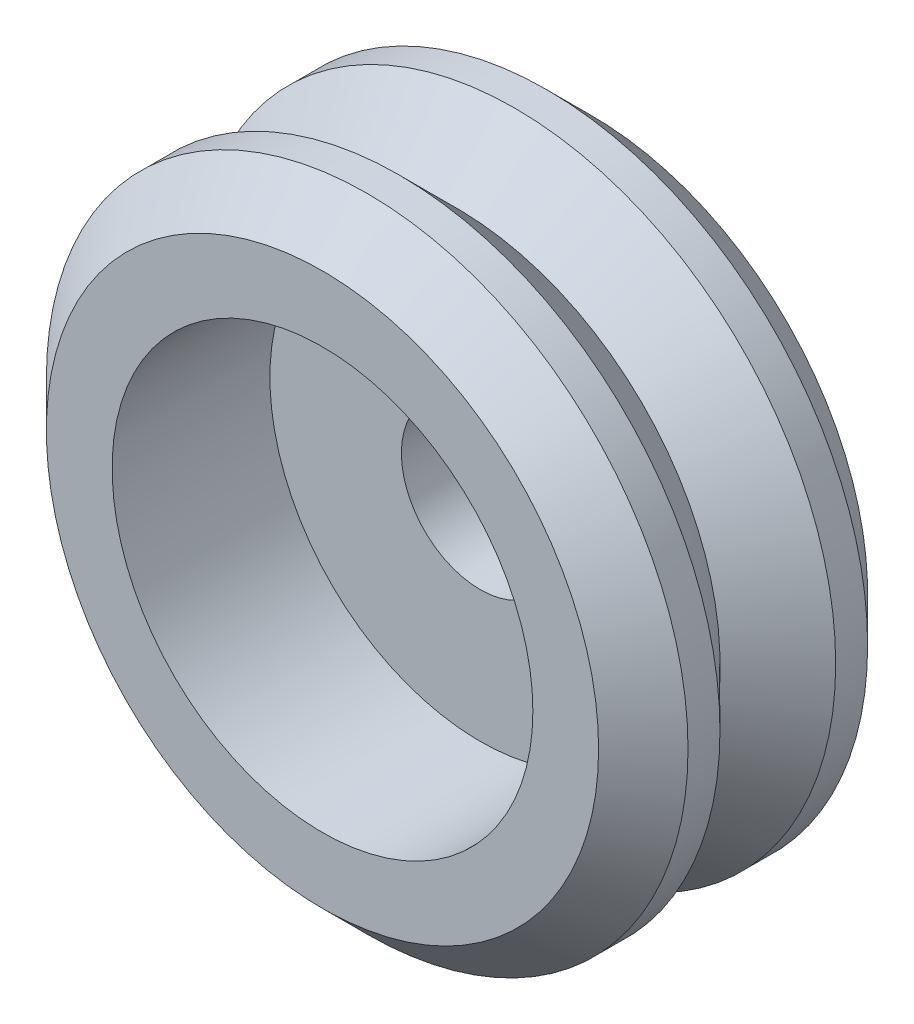
ISO-10303-21;
HEADER;
FILE_DESCRIPTION(('STEP AP214'),'2;1');
FILE_NAME('part.step','',(''),(''),'','','');
FILE_SCHEMA(('AUTOMOTIVE_DESIGN { 1 0 10303 214 1 1 1 1 }'));
ENDSEC;
DATA;
#1=APPLICATION_CONTEXT('core data for automotive mechanical design processes');
#2=APPLICATION_PROTOCOL_DEFINITION('international standard','automotive_design',2000,#1);
#3=PRODUCT_CONTEXT('',#1,'mechanical');
#4=PRODUCT('Part','Part','',(#3));
#5=PRODUCT_RELATED_PRODUCT_CATEGORY('part','',(#4));
#6=PRODUCT_DEFINITION_FORMATION('','',#4);
#7=PRODUCT_DEFINITION_CONTEXT('part definition',#1,'design');
#8=PRODUCT_DEFINITION('design','',#6,#7);
#9=PRODUCT_DEFINITION_SHAPE('','',#8);
#10=(LENGTH_UNIT() NAMED_UNIT(*) SI_UNIT(.MILLI.,.METRE.));
#11=(NAMED_UNIT(*) PLANE_ANGLE_UNIT() SI_UNIT($,.RADIAN.));
#12=(NAMED_UNIT(*) SI_UNIT($,.STERADIAN.) SOLID_ANGLE_UNIT());
#13=UNCERTAINTY_MEASURE_WITH_UNIT(LENGTH_MEASURE(1.E-05),#10,'distance_accuracy_value','');
#14=(GEOMETRIC_REPRESENTATION_CONTEXT(3) GLOBAL_UNCERTAINTY_ASSIGNED_CONTEXT((#13)) GLOBAL_UNIT_ASSIGNED_CONTEXT((#10,
#11,#12)) REPRESENTATION_CONTEXT('',''));
#15=CARTESIAN_POINT('',(0.,0.,0.));
#16=DIRECTION('',(0.,0.,1.));
#17=DIRECTION('',(1.,0.,0.));
#18=AXIS2_PLACEMENT_3D('',#15,#16,#17);
#19=CARTESIAN_POINT('',(0.,0.,10.23));
#20=DIRECTION('',(0.,0.,-1.));
#21=DIRECTION('',(-1.,0.,0.));
#22=AXIS2_PLACEMENT_3D('',#19,#20,#21);
#23=CYLINDRICAL_SURFACE('',#22,12.2);
#24=CARTESIAN_POINT('',(0.,0.,8.53000000000001));
#25=DIRECTION('',(0.,0.,-1.));
#26=DIRECTION('',(-1.,0.,0.));
#27=AXIS2_PLACEMENT_3D('',#24,#25,#26);
#28=CIRCLE('',#27,12.2);
#29=CARTESIAN_POINT('',(-12.2,0.,8.53000000000001));
#30=VERTEX_POINT('',#29);
#31=EDGE_CURVE('E10',#30,#30,#28,.F.);
#32=ORIENTED_EDGE('',*,*,#31,.F.);
#33=EDGE_LOOP('',(#32));
#34=FACE_BOUND('',#33,.T.);
#35=CARTESIAN_POINT('',(0.,0.,7.31499999999999));
#36=DIRECTION('',(0.,0.,1.));
#37=DIRECTION('',(1.,0.,0.));
#38=AXIS2_PLACEMENT_3D('',#35,#36,#37);
#39=CIRCLE('',#38,12.2);
#40=CARTESIAN_POINT('',(12.2,0.,7.31499999999999));
#41=VERTEX_POINT('',#40);
#42=EDGE_CURVE('E60',#41,#41,#39,.F.);
#43=ORIENTED_EDGE('',*,*,#42,.F.);
#44=EDGE_LOOP('',(#43));
#45=FACE_BOUND('',#44,.T.);
#46=ADVANCED_FACE('F41',(#34,#45),#23,.T.);
#47=CARTESIAN_POINT('',(0.,0.,2.91500000000001));
#48=DIRECTION('',(0.,0.,-1.));
#49=DIRECTION('',(-1.,0.,0.));
#50=AXIS2_PLACEMENT_3D('',#47,#48,#49);
#51=CIRCLE('',#50,12.2);
#52=CARTESIAN_POINT('',(-12.2,0.,2.91500000000001));
#53=VERTEX_POINT('',#52);
#54=EDGE_CURVE('E58',#53,#53,#51,.T.);
#55=ORIENTED_EDGE('',*,*,#54,.T.);
#56=EDGE_LOOP('',(#55));
#57=FACE_BOUND('',#56,.T.);
#58=CARTESIAN_POINT('',(0.,0.,1.69999999999999));
#59=DIRECTION('',(0.,0.,1.));
#60=DIRECTION('',(1.,0.,0.));
#61=AXIS2_PLACEMENT_3D('',#58,#59,#60);
#62=CIRCLE('',#61,12.2);
#63=CARTESIAN_POINT('',(12.2,0.,1.69999999999999));
#64=VERTEX_POINT('',#63);
#65=EDGE_CURVE('E54',#64,#64,#62,.F.);
#66=ORIENTED_EDGE('',*,*,#65,.F.);
#67=EDGE_LOOP('',(#66));
#68=FACE_BOUND('',#67,.T.);
#69=ADVANCED_FACE('F43',(#57,#68),#23,.T.);
#70=CARTESIAN_POINT('',(0.,0.,0.));
#71=DIRECTION('',(0.,0.,1.));
#72=DIRECTION('',(1.,0.,0.));
#73=AXIS2_PLACEMENT_3D('',#70,#71,#72);
#74=PLANE('',#73);
#75=CARTESIAN_POINT('',(0.,0.,0.));
#76=DIRECTION('',(0.,0.,-1.));
#77=DIRECTION('',(-1.,0.,0.));
#78=AXIS2_PLACEMENT_3D('',#75,#76,#77);
#79=CIRCLE('',#78,3.);
#80=CARTESIAN_POINT('',(-3.,0.,0.));
#81=VERTEX_POINT('',#80);
#82=EDGE_CURVE('E80',#81,#81,#79,.T.);
#83=ORIENTED_EDGE('',*,*,#82,.F.);
#84=EDGE_LOOP('',(#83));
#85=FACE_BOUND('',#84,.T.);
#86=CARTESIAN_POINT('',(0.,0.,0.));
#87=DIRECTION('',(0.,0.,-1.));
#88=DIRECTION('',(-1.,0.,0.));
#89=AXIS2_PLACEMENT_3D('',#86,#87,#88);
#90=CIRCLE('',#89,10.5);
#91=CARTESIAN_POINT('',(-10.5,0.,0.));
#92=VERTEX_POINT('',#91);
#93=EDGE_CURVE('E63',#92,#92,#90,.T.);
#94=ORIENTED_EDGE('',*,*,#93,.T.);
#95=EDGE_LOOP('',(#94));
#96=FACE_BOUND('',#95,.T.);
#97=ADVANCED_FACE('F106',(#85,#96),#74,.F.);
#98=CARTESIAN_POINT('',(0.,0.,10.23));
#99=DIRECTION('',(0.,0.,1.));
#100=DIRECTION('',(1.,0.,0.));
#101=AXIS2_PLACEMENT_3D('',#98,#99,#100);
#102=PLANE('',#101);
#103=CARTESIAN_POINT('',(0.,0.,10.23));
#104=DIRECTION('',(0.,0.,1.));
#105=DIRECTION('',(1.,0.,0.));
#106=AXIS2_PLACEMENT_3D('',#103,#104,#105);
#107=CIRCLE('',#106,8.);
#108=CARTESIAN_POINT('',(8.,0.,10.23));
#109=VERTEX_POINT('',#108);
#110=EDGE_CURVE('E75',#109,#109,#107,.T.);
#111=ORIENTED_EDGE('',*,*,#110,.F.);
#112=EDGE_LOOP('',(#111));
#113=FACE_BOUND('',#112,.T.);
#114=CARTESIAN_POINT('',(0.,0.,10.23));
#115=DIRECTION('',(0.,0.,1.));
#116=DIRECTION('',(1.,0.,0.));
#117=AXIS2_PLACEMENT_3D('',#114,#115,#116);
#118=CIRCLE('',#117,10.5);
#119=CARTESIAN_POINT('',(10.5,0.,10.23));
#120=VERTEX_POINT('',#119);
#121=EDGE_CURVE('E49',#120,#120,#118,.T.);
#122=ORIENTED_EDGE('',*,*,#121,.T.);
#123=EDGE_LOOP('',(#122));
#124=FACE_BOUND('',#123,.T.);
#125=ADVANCED_FACE('F102',(#113,#124),#102,.T.);
#126=CARTESIAN_POINT('',(0.,0.,10.23));
#127=DIRECTION('',(0.,0.,-1.));
#128=DIRECTION('',(1.,0.,0.));
#129=AXIS2_PLACEMENT_3D('',#126,#127,#128);
#130=CONICAL_SURFACE('',#129,10.5,0.78539816339745);
#131=ORIENTED_EDGE('',*,*,#121,.F.);
#132=EDGE_LOOP('',(#131));
#133=FACE_BOUND('',#132,.T.);
#134=ORIENTED_EDGE('',*,*,#31,.T.);
#135=EDGE_LOOP('',(#134));
#136=FACE_BOUND('',#135,.T.);
#137=ADVANCED_FACE('F105',(#133,#136),#130,.T.);
#138=CARTESIAN_POINT('',(0.,0.,0.));
#139=DIRECTION('',(0.,0.,1.));
#140=DIRECTION('',(-1.,0.,0.));
#141=AXIS2_PLACEMENT_3D('',#138,#139,#140);
#142=CONICAL_SURFACE('',#141,10.5,0.78539816339745);
#143=ORIENTED_EDGE('',*,*,#93,.F.);
#144=EDGE_LOOP('',(#143));
#145=FACE_BOUND('',#144,.T.);
#146=ORIENTED_EDGE('',*,*,#65,.T.);
#147=EDGE_LOOP('',(#146));
#148=FACE_BOUND('',#147,.T.);
#149=ADVANCED_FACE('F111',(#145,#148),#142,.T.);
#150=CARTESIAN_POINT('',(0.,0.,5.115));
#151=DIRECTION('',(0.,0.,1.));
#152=DIRECTION('',(-1.,0.,0.));
#153=AXIS2_PLACEMENT_3D('',#150,#151,#152);
#154=CONICAL_SURFACE('',#153,10.,0.78539816339745);
#155=CARTESIAN_POINT('',(0.,0.,5.115));
#156=DIRECTION('',(0.,0.,-1.));
#157=DIRECTION('',(-1.,0.,0.));
#158=AXIS2_PLACEMENT_3D('',#155,#156,#157);
#159=CIRCLE('',#158,10.);
#160=CARTESIAN_POINT('',(-10.,0.,5.115));
#161=VERTEX_POINT('',#160);
#162=EDGE_CURVE('E61',#161,#161,#159,.T.);
#163=ORIENTED_EDGE('',*,*,#162,.F.);
#164=EDGE_LOOP('',(#163));
#165=FACE_BOUND('',#164,.T.);
#166=ORIENTED_EDGE('',*,*,#42,.T.);
#167=EDGE_LOOP('',(#166));
#168=FACE_BOUND('',#167,.T.);
#169=ADVANCED_FACE('F118',(#165,#168),#154,.T.);
#170=CARTESIAN_POINT('',(0.,0.,5.115));
#171=DIRECTION('',(0.,0.,-1.));
#172=DIRECTION('',(-1.,0.,0.));
#173=AXIS2_PLACEMENT_3D('',#170,#171,#172);
#174=CONICAL_SURFACE('',#173,10.,0.78539816339745);
#175=ORIENTED_EDGE('',*,*,#162,.T.);
#176=EDGE_LOOP('',(#175));
#177=FACE_BOUND('',#176,.T.);
#178=ORIENTED_EDGE('',*,*,#54,.F.);
#179=EDGE_LOOP('',(#178));
#180=FACE_BOUND('',#179,.T.);
#181=ADVANCED_FACE('F98',(#177,#180),#174,.T.);
#182=CARTESIAN_POINT('',(0.,0.,4.23));
#183=DIRECTION('',(0.,0.,1.));
#184=DIRECTION('',(1.,0.,0.));
#185=AXIS2_PLACEMENT_3D('',#182,#183,#184);
#186=CYLINDRICAL_SURFACE('',#185,8.);
#187=CARTESIAN_POINT('',(0.,0.,4.23));
#188=DIRECTION('',(0.,0.,1.));
#189=DIRECTION('',(1.,0.,0.));
#190=AXIS2_PLACEMENT_3D('',#187,#188,#189);
#191=CIRCLE('',#190,8.);
#192=CARTESIAN_POINT('',(8.,0.,4.23));
#193=VERTEX_POINT('',#192);
#194=EDGE_CURVE('E74',#193,#193,#191,.T.);
#195=ORIENTED_EDGE('',*,*,#194,.F.);
#196=EDGE_LOOP('',(#195));
#197=FACE_BOUND('',#196,.T.);
#198=ORIENTED_EDGE('',*,*,#110,.T.);
#199=EDGE_LOOP('',(#198));
#200=FACE_BOUND('',#199,.T.);
#201=ADVANCED_FACE('F92',(#197,#200),#186,.F.);
#202=CARTESIAN_POINT('',(0.,0.,4.23));
#203=DIRECTION('',(0.,0.,1.));
#204=DIRECTION('',(1.,0.,0.));
#205=AXIS2_PLACEMENT_3D('',#202,#203,#204);
#206=PLANE('',#205);
#207=CARTESIAN_POINT('',(0.,0.,4.23));
#208=DIRECTION('',(0.,0.,1.));
#209=DIRECTION('',(1.,0.,0.));
#210=AXIS2_PLACEMENT_3D('',#207,#208,#209);
#211=CIRCLE('',#210,3.);
#212=CARTESIAN_POINT('',(3.,0.,4.23));
#213=VERTEX_POINT('',#212);
#214=EDGE_CURVE('E45',#213,#213,#211,.T.);
#215=ORIENTED_EDGE('',*,*,#214,.F.);
#216=EDGE_LOOP('',(#215));
#217=FACE_BOUND('',#216,.T.);
#218=ORIENTED_EDGE('',*,*,#194,.T.);
#219=EDGE_LOOP('',(#218));
#220=FACE_BOUND('',#219,.T.);
#221=ADVANCED_FACE('F89',(#217,#220),#206,.T.);
#222=CARTESIAN_POINT('',(0.,0.,10.23));
#223=DIRECTION('',(0.,0.,-1.));
#224=DIRECTION('',(-1.,0.,0.));
#225=AXIS2_PLACEMENT_3D('',#222,#223,#224);
#226=CYLINDRICAL_SURFACE('',#225,3.);
#227=ORIENTED_EDGE('',*,*,#214,.T.);
#228=EDGE_LOOP('',(#227));
#229=FACE_BOUND('',#228,.T.);
#230=ORIENTED_EDGE('',*,*,#82,.T.);
#231=EDGE_LOOP('',(#230));
#232=FACE_BOUND('',#231,.T.);
#233=ADVANCED_FACE('F87',(#229,#232),#226,.F.);
#234=CLOSED_SHELL('',(#46,#69,#97,#125,#137,#149,#169,#181,#201,#221,#233));
#235=MANIFOLD_SOLID_BREP('B2',#234);
#236=ADVANCED_BREP_SHAPE_REPRESENTATION('',(#18,#235),#14);
#237=SHAPE_DEFINITION_REPRESENTATION(#9,#236);
ENDSEC;
END-ISO-10303-21;
